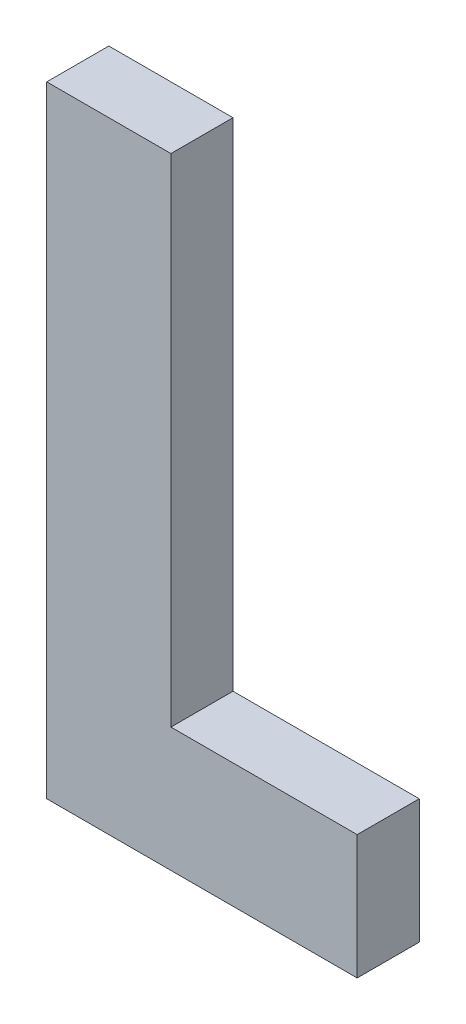
ISO-10303-21;
HEADER;
FILE_DESCRIPTION(('STEP AP214'),'2;1');
FILE_NAME('part.step','',(''),(''),'','','');
FILE_SCHEMA(('AUTOMOTIVE_DESIGN { 1 0 10303 214 1 1 1 1 }'));
ENDSEC;
DATA;
#1=APPLICATION_CONTEXT('core data for automotive mechanical design processes');
#2=APPLICATION_PROTOCOL_DEFINITION('international standard','automotive_design',2000,#1);
#3=PRODUCT_CONTEXT('',#1,'mechanical');
#4=PRODUCT('Part','Part','',(#3));
#5=PRODUCT_RELATED_PRODUCT_CATEGORY('part','',(#4));
#6=PRODUCT_DEFINITION_FORMATION('','',#4);
#7=PRODUCT_DEFINITION_CONTEXT('part definition',#1,'design');
#8=PRODUCT_DEFINITION('design','',#6,#7);
#9=PRODUCT_DEFINITION_SHAPE('','',#8);
#10=(LENGTH_UNIT() NAMED_UNIT(*) SI_UNIT(.MILLI.,.METRE.));
#11=(NAMED_UNIT(*) PLANE_ANGLE_UNIT() SI_UNIT($,.RADIAN.));
#12=(NAMED_UNIT(*) SI_UNIT($,.STERADIAN.) SOLID_ANGLE_UNIT());
#13=UNCERTAINTY_MEASURE_WITH_UNIT(LENGTH_MEASURE(1.E-05),#10,'distance_accuracy_value','');
#14=(GEOMETRIC_REPRESENTATION_CONTEXT(3) GLOBAL_UNCERTAINTY_ASSIGNED_CONTEXT((#13)) GLOBAL_UNIT_ASSIGNED_CONTEXT((#10,
#11,#12)) REPRESENTATION_CONTEXT('',''));
#15=CARTESIAN_POINT('',(0.,0.,0.));
#16=DIRECTION('',(0.,0.,1.));
#17=DIRECTION('',(1.,0.,0.));
#18=AXIS2_PLACEMENT_3D('',#15,#16,#17);
#19=CARTESIAN_POINT('',(0.,-80.,10.));
#20=DIRECTION('',(1.,0.,0.));
#21=DIRECTION('',(0.,0.,-1.));
#22=AXIS2_PLACEMENT_3D('',#19,#20,#21);
#23=PLANE('',#22);
#24=DIRECTION('',(0.,-1.,0.));
#25=VECTOR('',#24,1.);
#26=CARTESIAN_POINT('',(0.,-80.,0.));
#27=LINE('',#26,#25);
#28=CARTESIAN_POINT('',(0.,0.,0.));
#29=VERTEX_POINT('',#28);
#30=CARTESIAN_POINT('',(0.,-100.,0.));
#31=VERTEX_POINT('',#30);
#32=EDGE_CURVE('E86',#29,#31,#27,.T.);
#33=ORIENTED_EDGE('',*,*,#32,.T.);
#34=DIRECTION('',(0.,0.,-1.));
#35=VECTOR('',#34,1.);
#36=CARTESIAN_POINT('',(0.,-100.,10.));
#37=LINE('',#36,#35);
#38=CARTESIAN_POINT('',(0.,-100.,10.));
#39=VERTEX_POINT('',#38);
#40=EDGE_CURVE('E11',#39,#31,#37,.T.);
#41=ORIENTED_EDGE('',*,*,#40,.F.);
#42=DIRECTION('',(0.,-1.,0.));
#43=VECTOR('',#42,1.);
#44=CARTESIAN_POINT('',(0.,0.,10.));
#45=LINE('',#44,#43);
#46=CARTESIAN_POINT('',(0.,0.,10.));
#47=VERTEX_POINT('',#46);
#48=EDGE_CURVE('E92',#47,#39,#45,.T.);
#49=ORIENTED_EDGE('',*,*,#48,.F.);
#50=DIRECTION('',(0.,0.,-1.));
#51=VECTOR('',#50,1.);
#52=CARTESIAN_POINT('',(0.,0.,10.));
#53=LINE('',#52,#51);
#54=EDGE_CURVE('E124',#47,#29,#53,.T.);
#55=ORIENTED_EDGE('',*,*,#54,.T.);
#56=EDGE_LOOP('',(#33,#41,#49,#55));
#57=FACE_BOUND('',#56,.T.);
#58=ADVANCED_FACE('F39',(#57),#23,.F.);
#59=CARTESIAN_POINT('',(0.,-100.,10.));
#60=DIRECTION('',(0.,1.,0.));
#61=DIRECTION('',(0.,0.,1.));
#62=AXIS2_PLACEMENT_3D('',#59,#60,#61);
#63=PLANE('',#62);
#64=DIRECTION('',(1.,0.,0.));
#65=VECTOR('',#64,1.);
#66=CARTESIAN_POINT('',(0.,-100.,0.));
#67=LINE('',#66,#65);
#68=CARTESIAN_POINT('',(50.,-100.,0.));
#69=VERTEX_POINT('',#68);
#70=EDGE_CURVE('E130',#31,#69,#67,.T.);
#71=ORIENTED_EDGE('',*,*,#70,.T.);
#72=DIRECTION('',(0.,0.,-1.));
#73=VECTOR('',#72,1.);
#74=CARTESIAN_POINT('',(50.,-100.,10.));
#75=LINE('',#74,#73);
#76=CARTESIAN_POINT('',(50.,-100.,10.));
#77=VERTEX_POINT('',#76);
#78=EDGE_CURVE('E48',#77,#69,#75,.T.);
#79=ORIENTED_EDGE('',*,*,#78,.F.);
#80=DIRECTION('',(1.,0.,0.));
#81=VECTOR('',#80,1.);
#82=CARTESIAN_POINT('',(0.,-100.,10.));
#83=LINE('',#82,#81);
#84=EDGE_CURVE('E162',#39,#77,#83,.T.);
#85=ORIENTED_EDGE('',*,*,#84,.F.);
#86=ORIENTED_EDGE('',*,*,#40,.T.);
#87=EDGE_LOOP('',(#71,#79,#85,#86));
#88=FACE_BOUND('',#87,.T.);
#89=ADVANCED_FACE('F167',(#88),#63,.F.);
#90=CARTESIAN_POINT('',(50.,-80.,10.));
#91=DIRECTION('',(-1.,0.,0.));
#92=DIRECTION('',(0.,0.,1.));
#93=AXIS2_PLACEMENT_3D('',#90,#91,#92);
#94=PLANE('',#93);
#95=DIRECTION('',(0.,1.,0.));
#96=VECTOR('',#95,1.);
#97=CARTESIAN_POINT('',(50.,-80.,0.));
#98=LINE('',#97,#96);
#99=CARTESIAN_POINT('',(50.,-80.,0.));
#100=VERTEX_POINT('',#99);
#101=EDGE_CURVE('E133',#69,#100,#98,.T.);
#102=ORIENTED_EDGE('',*,*,#101,.T.);
#103=DIRECTION('',(0.,0.,-1.));
#104=VECTOR('',#103,1.);
#105=CARTESIAN_POINT('',(50.,-80.,10.));
#106=LINE('',#105,#104);
#107=CARTESIAN_POINT('',(50.,-80.,10.));
#108=VERTEX_POINT('',#107);
#109=EDGE_CURVE('E117',#108,#100,#106,.T.);
#110=ORIENTED_EDGE('',*,*,#109,.F.);
#111=DIRECTION('',(0.,1.,0.));
#112=VECTOR('',#111,1.);
#113=CARTESIAN_POINT('',(50.,-80.,10.));
#114=LINE('',#113,#112);
#115=EDGE_CURVE('E106',#77,#108,#114,.T.);
#116=ORIENTED_EDGE('',*,*,#115,.F.);
#117=ORIENTED_EDGE('',*,*,#78,.T.);
#118=EDGE_LOOP('',(#102,#110,#116,#117));
#119=FACE_BOUND('',#118,.T.);
#120=ADVANCED_FACE('F154',(#119),#94,.F.);
#121=CARTESIAN_POINT('',(20.,-80.,10.));
#122=DIRECTION('',(0.,-1.,0.));
#123=DIRECTION('',(0.,0.,-1.));
#124=AXIS2_PLACEMENT_3D('',#121,#122,#123);
#125=PLANE('',#124);
#126=DIRECTION('',(-1.,0.,0.));
#127=VECTOR('',#126,1.);
#128=CARTESIAN_POINT('',(20.,-80.,0.));
#129=LINE('',#128,#127);
#130=CARTESIAN_POINT('',(20.,-80.,0.));
#131=VERTEX_POINT('',#130);
#132=EDGE_CURVE('E115',#100,#131,#129,.T.);
#133=ORIENTED_EDGE('',*,*,#132,.T.);
#134=DIRECTION('',(0.,0.,-1.));
#135=VECTOR('',#134,1.);
#136=CARTESIAN_POINT('',(20.,-80.,10.));
#137=LINE('',#136,#135);
#138=CARTESIAN_POINT('',(20.,-80.,10.));
#139=VERTEX_POINT('',#138);
#140=EDGE_CURVE('E112',#139,#131,#137,.T.);
#141=ORIENTED_EDGE('',*,*,#140,.F.);
#142=DIRECTION('',(-1.,0.,0.));
#143=VECTOR('',#142,1.);
#144=CARTESIAN_POINT('',(20.,-80.,10.));
#145=LINE('',#144,#143);
#146=EDGE_CURVE('E100',#108,#139,#145,.T.);
#147=ORIENTED_EDGE('',*,*,#146,.F.);
#148=ORIENTED_EDGE('',*,*,#109,.T.);
#149=EDGE_LOOP('',(#133,#141,#147,#148));
#150=FACE_BOUND('',#149,.T.);
#151=ADVANCED_FACE('F113',(#150),#125,.F.);
#152=CARTESIAN_POINT('',(20.,0.,10.));
#153=DIRECTION('',(-1.,0.,0.));
#154=DIRECTION('',(0.,0.,1.));
#155=AXIS2_PLACEMENT_3D('',#152,#153,#154);
#156=PLANE('',#155);
#157=DIRECTION('',(0.,1.,0.));
#158=VECTOR('',#157,1.);
#159=CARTESIAN_POINT('',(20.,0.,0.));
#160=LINE('',#159,#158);
#161=CARTESIAN_POINT('',(20.,0.,0.));
#162=VERTEX_POINT('',#161);
#163=EDGE_CURVE('E79',#131,#162,#160,.T.);
#164=ORIENTED_EDGE('',*,*,#163,.T.);
#165=DIRECTION('',(0.,0.,-1.));
#166=VECTOR('',#165,1.);
#167=CARTESIAN_POINT('',(20.,0.,10.));
#168=LINE('',#167,#166);
#169=CARTESIAN_POINT('',(20.,0.,10.));
#170=VERTEX_POINT('',#169);
#171=EDGE_CURVE('E118',#170,#162,#168,.T.);
#172=ORIENTED_EDGE('',*,*,#171,.F.);
#173=DIRECTION('',(0.,1.,0.));
#174=VECTOR('',#173,1.);
#175=CARTESIAN_POINT('',(20.,0.,10.));
#176=LINE('',#175,#174);
#177=EDGE_CURVE('E104',#139,#170,#176,.T.);
#178=ORIENTED_EDGE('',*,*,#177,.F.);
#179=ORIENTED_EDGE('',*,*,#140,.T.);
#180=EDGE_LOOP('',(#164,#172,#178,#179));
#181=FACE_BOUND('',#180,.T.);
#182=ADVANCED_FACE('F120',(#181),#156,.F.);
#183=CARTESIAN_POINT('',(0.,0.,10.));
#184=DIRECTION('',(0.,-1.,0.));
#185=DIRECTION('',(0.,0.,-1.));
#186=AXIS2_PLACEMENT_3D('',#183,#184,#185);
#187=PLANE('',#186);
#188=DIRECTION('',(-1.,0.,0.));
#189=VECTOR('',#188,1.);
#190=CARTESIAN_POINT('',(0.,0.,0.));
#191=LINE('',#190,#189);
#192=EDGE_CURVE('E140',#162,#29,#191,.T.);
#193=ORIENTED_EDGE('',*,*,#192,.T.);
#194=ORIENTED_EDGE('',*,*,#54,.F.);
#195=DIRECTION('',(-1.,0.,0.));
#196=VECTOR('',#195,1.);
#197=CARTESIAN_POINT('',(0.,0.,10.));
#198=LINE('',#197,#196);
#199=EDGE_CURVE('E56',#170,#47,#198,.T.);
#200=ORIENTED_EDGE('',*,*,#199,.F.);
#201=ORIENTED_EDGE('',*,*,#171,.T.);
#202=EDGE_LOOP('',(#193,#194,#200,#201));
#203=FACE_BOUND('',#202,.T.);
#204=ADVANCED_FACE('F159',(#203),#187,.F.);
#205=CARTESIAN_POINT('',(0.,0.,10.));
#206=DIRECTION('',(0.,0.,1.));
#207=DIRECTION('',(1.,0.,0.));
#208=AXIS2_PLACEMENT_3D('',#205,#206,#207);
#209=PLANE('',#208);
#210=ORIENTED_EDGE('',*,*,#48,.T.);
#211=ORIENTED_EDGE('',*,*,#84,.T.);
#212=ORIENTED_EDGE('',*,*,#115,.T.);
#213=ORIENTED_EDGE('',*,*,#146,.T.);
#214=ORIENTED_EDGE('',*,*,#177,.T.);
#215=ORIENTED_EDGE('',*,*,#199,.T.);
#216=EDGE_LOOP('',(#210,#211,#212,#213,#214,#215));
#217=FACE_BOUND('',#216,.T.);
#218=ADVANCED_FACE('F102',(#217),#209,.T.);
#219=CARTESIAN_POINT('',(0.,0.,0.));
#220=DIRECTION('',(0.,0.,1.));
#221=DIRECTION('',(1.,0.,0.));
#222=AXIS2_PLACEMENT_3D('',#219,#220,#221);
#223=PLANE('',#222);
#224=ORIENTED_EDGE('',*,*,#32,.F.);
#225=ORIENTED_EDGE('',*,*,#192,.F.);
#226=ORIENTED_EDGE('',*,*,#163,.F.);
#227=ORIENTED_EDGE('',*,*,#132,.F.);
#228=ORIENTED_EDGE('',*,*,#101,.F.);
#229=ORIENTED_EDGE('',*,*,#70,.F.);
#230=EDGE_LOOP('',(#224,#225,#226,#227,#228,#229));
#231=FACE_BOUND('',#230,.T.);
#232=ADVANCED_FACE('F157',(#231),#223,.F.);
#233=CLOSED_SHELL('',(#58,#89,#120,#151,#182,#204,#218,#232));
#234=MANIFOLD_SOLID_BREP('B2',#233);
#235=ADVANCED_BREP_SHAPE_REPRESENTATION('',(#18,#234),#14);
#236=SHAPE_DEFINITION_REPRESENTATION(#9,#235);
ENDSEC;
END-ISO-10303-21;
